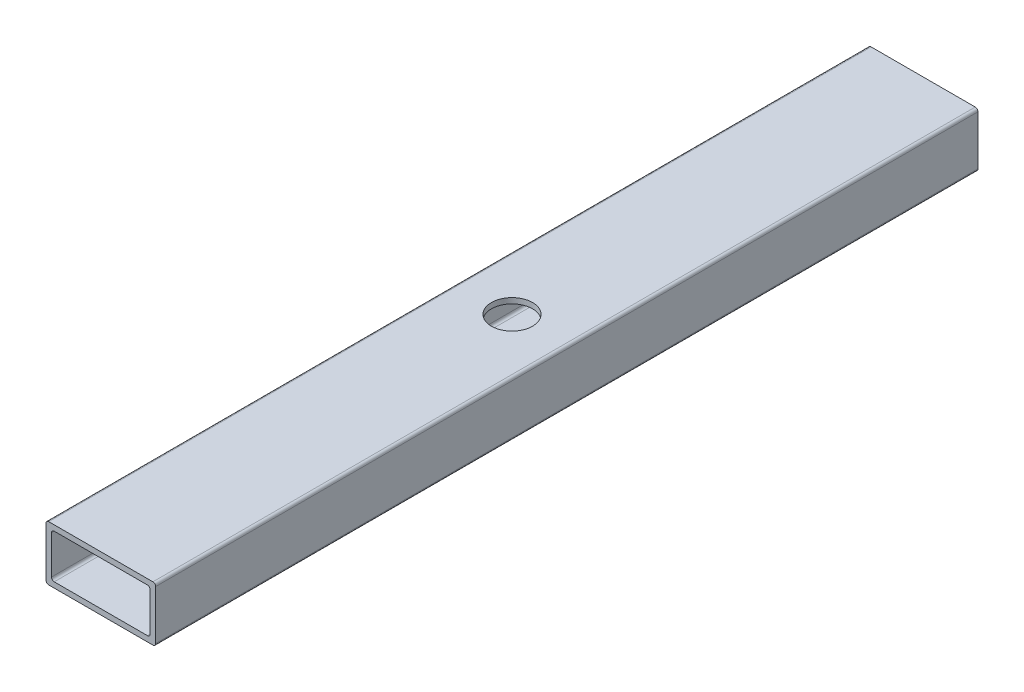
ISO-10303-21;
HEADER;
FILE_DESCRIPTION(('STEP AP214'),'2;1');
FILE_NAME('part.step','',(''),(''),'','','');
FILE_SCHEMA(('AUTOMOTIVE_DESIGN { 1 0 10303 214 1 1 1 1 }'));
ENDSEC;
DATA;
#1=APPLICATION_CONTEXT('core data for automotive mechanical design processes');
#2=APPLICATION_PROTOCOL_DEFINITION('international standard','automotive_design',2000,#1);
#3=PRODUCT_CONTEXT('',#1,'mechanical');
#4=PRODUCT('Part','Part','',(#3));
#5=PRODUCT_RELATED_PRODUCT_CATEGORY('part','',(#4));
#6=PRODUCT_DEFINITION_FORMATION('','',#4);
#7=PRODUCT_DEFINITION_CONTEXT('part definition',#1,'design');
#8=PRODUCT_DEFINITION('design','',#6,#7);
#9=PRODUCT_DEFINITION_SHAPE('','',#8);
#10=(LENGTH_UNIT() NAMED_UNIT(*) SI_UNIT(.MILLI.,.METRE.));
#11=(NAMED_UNIT(*) PLANE_ANGLE_UNIT() SI_UNIT($,.RADIAN.));
#12=(NAMED_UNIT(*) SI_UNIT($,.STERADIAN.) SOLID_ANGLE_UNIT());
#13=UNCERTAINTY_MEASURE_WITH_UNIT(LENGTH_MEASURE(1.E-05),#10,'distance_accuracy_value','');
#14=(GEOMETRIC_REPRESENTATION_CONTEXT(3) GLOBAL_UNCERTAINTY_ASSIGNED_CONTEXT((#13)) GLOBAL_UNIT_ASSIGNED_CONTEXT((#10,
#11,#12)) REPRESENTATION_CONTEXT('',''));
#15=CARTESIAN_POINT('',(0.,0.,0.));
#16=DIRECTION('',(0.,0.,1.));
#17=DIRECTION('',(1.,0.,0.));
#18=AXIS2_PLACEMENT_3D('',#15,#16,#17);
#19=CARTESIAN_POINT('',(78.,0.,600.));
#20=DIRECTION('',(0.,0.,-1.));
#21=DIRECTION('',(-1.,0.,0.));
#22=AXIS2_PLACEMENT_3D('',#19,#20,#21);
#23=PLANE('',#22);
#24=CARTESIAN_POINT('',(78.,0.,600.));
#25=DIRECTION('',(0.,0.,1.));
#26=DIRECTION('',(-1.,0.,0.));
#27=AXIS2_PLACEMENT_3D('',#24,#25,#26);
#28=CIRCLE('',#27,2.);
#29=CARTESIAN_POINT('',(78.,-2.,600.));
#30=VERTEX_POINT('',#29);
#31=CARTESIAN_POINT('',(80.,0.,600.));
#32=VERTEX_POINT('',#31);
#33=EDGE_CURVE('E214',#30,#32,#28,.T.);
#34=ORIENTED_EDGE('',*,*,#33,.T.);
#35=DIRECTION('',(0.,1.,0.));
#36=VECTOR('',#35,1.);
#37=CARTESIAN_POINT('',(80.,0.,600.));
#38=LINE('',#37,#36);
#39=CARTESIAN_POINT('',(80.,36.,600.));
#40=VERTEX_POINT('',#39);
#41=EDGE_CURVE('E217',#32,#40,#38,.T.);
#42=ORIENTED_EDGE('',*,*,#41,.T.);
#43=CARTESIAN_POINT('',(78.,36.,600.));
#44=DIRECTION('',(0.,0.,1.));
#45=DIRECTION('',(1.,0.,0.));
#46=AXIS2_PLACEMENT_3D('',#43,#44,#45);
#47=CIRCLE('',#46,2.);
#48=CARTESIAN_POINT('',(78.,38.,600.));
#49=VERTEX_POINT('',#48);
#50=EDGE_CURVE('E220',#40,#49,#47,.T.);
#51=ORIENTED_EDGE('',*,*,#50,.T.);
#52=DIRECTION('',(-1.,0.,0.));
#53=VECTOR('',#52,1.);
#54=CARTESIAN_POINT('',(2.,38.,600.));
#55=LINE('',#54,#53);
#56=CARTESIAN_POINT('',(2.,38.,600.));
#57=VERTEX_POINT('',#56);
#58=EDGE_CURVE('E222',#49,#57,#55,.T.);
#59=ORIENTED_EDGE('',*,*,#58,.T.);
#60=CARTESIAN_POINT('',(2.,36.,600.));
#61=DIRECTION('',(0.,0.,1.));
#62=DIRECTION('',(-1.,0.,0.));
#63=AXIS2_PLACEMENT_3D('',#60,#61,#62);
#64=CIRCLE('',#63,2.);
#65=CARTESIAN_POINT('',(0.,36.,600.));
#66=VERTEX_POINT('',#65);
#67=EDGE_CURVE('E224',#57,#66,#64,.T.);
#68=ORIENTED_EDGE('',*,*,#67,.T.);
#69=DIRECTION('',(0.,-1.,0.));
#70=VECTOR('',#69,1.);
#71=CARTESIAN_POINT('',(0.,0.,600.));
#72=LINE('',#71,#70);
#73=CARTESIAN_POINT('',(0.,0.,600.));
#74=VERTEX_POINT('',#73);
#75=EDGE_CURVE('E226',#66,#74,#72,.T.);
#76=ORIENTED_EDGE('',*,*,#75,.T.);
#77=CARTESIAN_POINT('',(2.,0.,600.));
#78=DIRECTION('',(0.,0.,1.));
#79=DIRECTION('',(1.,0.,0.));
#80=AXIS2_PLACEMENT_3D('',#77,#78,#79);
#81=CIRCLE('',#80,2.);
#82=CARTESIAN_POINT('',(2.,-2.,600.));
#83=VERTEX_POINT('',#82);
#84=EDGE_CURVE('E228',#74,#83,#81,.T.);
#85=ORIENTED_EDGE('',*,*,#84,.T.);
#86=DIRECTION('',(1.,0.,0.));
#87=VECTOR('',#86,1.);
#88=CARTESIAN_POINT('',(2.,-2.,600.));
#89=LINE('',#88,#87);
#90=EDGE_CURVE('E230',#83,#30,#89,.T.);
#91=ORIENTED_EDGE('',*,*,#90,.T.);
#92=EDGE_LOOP('',(#34,#42,#51,#59,#68,#76,#85,#91));
#93=FACE_BOUND('',#92,.T.);
#94=CARTESIAN_POINT('',(74.,4.,600.));
#95=DIRECTION('',(0.,0.,1.));
#96=DIRECTION('',(1.,0.,0.));
#97=AXIS2_PLACEMENT_3D('',#94,#95,#96);
#98=CIRCLE('',#97,2.);
#99=CARTESIAN_POINT('',(74.,2.,600.));
#100=VERTEX_POINT('',#99);
#101=CARTESIAN_POINT('',(76.,4.,600.));
#102=VERTEX_POINT('',#101);
#103=EDGE_CURVE('E147',#100,#102,#98,.T.);
#104=ORIENTED_EDGE('',*,*,#103,.F.);
#105=DIRECTION('',(1.,0.,0.));
#106=VECTOR('',#105,1.);
#107=CARTESIAN_POINT('',(6.,2.,600.));
#108=LINE('',#107,#106);
#109=CARTESIAN_POINT('',(6.00000000000001,2.,600.));
#110=VERTEX_POINT('',#109);
#111=EDGE_CURVE('E181',#110,#100,#108,.T.);
#112=ORIENTED_EDGE('',*,*,#111,.F.);
#113=CARTESIAN_POINT('',(6.,4.,600.));
#114=DIRECTION('',(0.,0.,1.));
#115=DIRECTION('',(-1.,0.,0.));
#116=AXIS2_PLACEMENT_3D('',#113,#114,#115);
#117=CIRCLE('',#116,2.);
#118=CARTESIAN_POINT('',(4.,4.,600.));
#119=VERTEX_POINT('',#118);
#120=EDGE_CURVE('E179',#119,#110,#117,.T.);
#121=ORIENTED_EDGE('',*,*,#120,.F.);
#122=DIRECTION('',(0.,-1.,0.));
#123=VECTOR('',#122,1.);
#124=CARTESIAN_POINT('',(4.,4.,600.));
#125=LINE('',#124,#123);
#126=CARTESIAN_POINT('',(4.,32.,600.));
#127=VERTEX_POINT('',#126);
#128=EDGE_CURVE('E177',#127,#119,#125,.T.);
#129=ORIENTED_EDGE('',*,*,#128,.F.);
#130=CARTESIAN_POINT('',(6.,32.,600.));
#131=DIRECTION('',(0.,0.,1.));
#132=DIRECTION('',(1.,0.,0.));
#133=AXIS2_PLACEMENT_3D('',#130,#131,#132);
#134=CIRCLE('',#133,2.);
#135=CARTESIAN_POINT('',(6.,34.,600.));
#136=VERTEX_POINT('',#135);
#137=EDGE_CURVE('E175',#136,#127,#134,.T.);
#138=ORIENTED_EDGE('',*,*,#137,.F.);
#139=DIRECTION('',(-1.,0.,0.));
#140=VECTOR('',#139,1.);
#141=CARTESIAN_POINT('',(6.,34.,600.));
#142=LINE('',#141,#140);
#143=CARTESIAN_POINT('',(74.,34.,600.));
#144=VERTEX_POINT('',#143);
#145=EDGE_CURVE('E170',#144,#136,#142,.T.);
#146=ORIENTED_EDGE('',*,*,#145,.F.);
#147=CARTESIAN_POINT('',(74.,32.,600.));
#148=DIRECTION('',(0.,0.,1.));
#149=DIRECTION('',(-1.,0.,0.));
#150=AXIS2_PLACEMENT_3D('',#147,#148,#149);
#151=CIRCLE('',#150,2.);
#152=CARTESIAN_POINT('',(76.,32.,600.));
#153=VERTEX_POINT('',#152);
#154=EDGE_CURVE('E168',#153,#144,#151,.T.);
#155=ORIENTED_EDGE('',*,*,#154,.F.);
#156=DIRECTION('',(0.,1.,0.));
#157=VECTOR('',#156,1.);
#158=CARTESIAN_POINT('',(76.,4.,600.));
#159=LINE('',#158,#157);
#160=EDGE_CURVE('E155',#102,#153,#159,.T.);
#161=ORIENTED_EDGE('',*,*,#160,.F.);
#162=EDGE_LOOP('',(#104,#112,#121,#129,#138,#146,#155,#161));
#163=FACE_BOUND('',#162,.T.);
#164=ADVANCED_FACE('F33',(#93,#163),#23,.F.);
#165=CARTESIAN_POINT('',(78.,0.,0.));
#166=DIRECTION('',(0.,0.,-1.));
#167=DIRECTION('',(-1.,0.,0.));
#168=AXIS2_PLACEMENT_3D('',#165,#166,#167);
#169=PLANE('',#168);
#170=CARTESIAN_POINT('',(78.,0.,0.));
#171=DIRECTION('',(0.,0.,1.));
#172=DIRECTION('',(-1.,0.,0.));
#173=AXIS2_PLACEMENT_3D('',#170,#171,#172);
#174=CIRCLE('',#173,2.);
#175=CARTESIAN_POINT('',(78.,-2.,0.));
#176=VERTEX_POINT('',#175);
#177=CARTESIAN_POINT('',(80.,0.,0.));
#178=VERTEX_POINT('',#177);
#179=EDGE_CURVE('E163',#176,#178,#174,.T.);
#180=ORIENTED_EDGE('',*,*,#179,.F.);
#181=DIRECTION('',(1.,0.,0.));
#182=VECTOR('',#181,1.);
#183=CARTESIAN_POINT('',(2.,-2.,0.));
#184=LINE('',#183,#182);
#185=CARTESIAN_POINT('',(2.,-2.,0.));
#186=VERTEX_POINT('',#185);
#187=EDGE_CURVE('E218',#186,#176,#184,.T.);
#188=ORIENTED_EDGE('',*,*,#187,.F.);
#189=CARTESIAN_POINT('',(2.,0.,0.));
#190=DIRECTION('',(0.,0.,1.));
#191=DIRECTION('',(1.,0.,0.));
#192=AXIS2_PLACEMENT_3D('',#189,#190,#191);
#193=CIRCLE('',#192,2.);
#194=CARTESIAN_POINT('',(0.,0.,0.));
#195=VERTEX_POINT('',#194);
#196=EDGE_CURVE('E245',#195,#186,#193,.T.);
#197=ORIENTED_EDGE('',*,*,#196,.F.);
#198=DIRECTION('',(0.,-1.,0.));
#199=VECTOR('',#198,1.);
#200=CARTESIAN_POINT('',(0.,0.,0.));
#201=LINE('',#200,#199);
#202=CARTESIAN_POINT('',(0.,36.,0.));
#203=VERTEX_POINT('',#202);
#204=EDGE_CURVE('E243',#203,#195,#201,.T.);
#205=ORIENTED_EDGE('',*,*,#204,.F.);
#206=CARTESIAN_POINT('',(2.,36.,0.));
#207=DIRECTION('',(0.,0.,1.));
#208=DIRECTION('',(-1.,0.,0.));
#209=AXIS2_PLACEMENT_3D('',#206,#207,#208);
#210=CIRCLE('',#209,2.);
#211=CARTESIAN_POINT('',(2.,38.,0.));
#212=VERTEX_POINT('',#211);
#213=EDGE_CURVE('E241',#212,#203,#210,.T.);
#214=ORIENTED_EDGE('',*,*,#213,.F.);
#215=DIRECTION('',(-1.,0.,0.));
#216=VECTOR('',#215,1.);
#217=CARTESIAN_POINT('',(2.,38.,0.));
#218=LINE('',#217,#216);
#219=CARTESIAN_POINT('',(78.,38.,0.));
#220=VERTEX_POINT('',#219);
#221=EDGE_CURVE('E239',#220,#212,#218,.T.);
#222=ORIENTED_EDGE('',*,*,#221,.F.);
#223=CARTESIAN_POINT('',(78.,36.,0.));
#224=DIRECTION('',(0.,0.,1.));
#225=DIRECTION('',(1.,0.,0.));
#226=AXIS2_PLACEMENT_3D('',#223,#224,#225);
#227=CIRCLE('',#226,2.);
#228=CARTESIAN_POINT('',(80.,36.,0.));
#229=VERTEX_POINT('',#228);
#230=EDGE_CURVE('E237',#229,#220,#227,.T.);
#231=ORIENTED_EDGE('',*,*,#230,.F.);
#232=DIRECTION('',(0.,1.,0.));
#233=VECTOR('',#232,1.);
#234=CARTESIAN_POINT('',(80.,0.,0.));
#235=LINE('',#234,#233);
#236=EDGE_CURVE('E235',#178,#229,#235,.T.);
#237=ORIENTED_EDGE('',*,*,#236,.F.);
#238=EDGE_LOOP('',(#180,#188,#197,#205,#214,#222,#231,#237));
#239=FACE_BOUND('',#238,.T.);
#240=DIRECTION('',(1.,0.,0.));
#241=VECTOR('',#240,1.);
#242=CARTESIAN_POINT('',(6.,2.,0.));
#243=LINE('',#242,#241);
#244=CARTESIAN_POINT('',(6.,2.,0.));
#245=VERTEX_POINT('',#244);
#246=CARTESIAN_POINT('',(74.,2.,0.));
#247=VERTEX_POINT('',#246);
#248=EDGE_CURVE('E156',#245,#247,#243,.T.);
#249=ORIENTED_EDGE('',*,*,#248,.T.);
#250=CARTESIAN_POINT('',(74.,4.,0.));
#251=DIRECTION('',(0.,0.,1.));
#252=DIRECTION('',(1.,0.,0.));
#253=AXIS2_PLACEMENT_3D('',#250,#251,#252);
#254=CIRCLE('',#253,2.);
#255=CARTESIAN_POINT('',(76.,4.,0.));
#256=VERTEX_POINT('',#255);
#257=EDGE_CURVE('E57',#247,#256,#254,.T.);
#258=ORIENTED_EDGE('',*,*,#257,.T.);
#259=DIRECTION('',(0.,1.,0.));
#260=VECTOR('',#259,1.);
#261=CARTESIAN_POINT('',(76.,4.,0.));
#262=LINE('',#261,#260);
#263=CARTESIAN_POINT('',(76.,32.,0.));
#264=VERTEX_POINT('',#263);
#265=EDGE_CURVE('E162',#256,#264,#262,.T.);
#266=ORIENTED_EDGE('',*,*,#265,.T.);
#267=CARTESIAN_POINT('',(74.,32.,0.));
#268=DIRECTION('',(0.,0.,1.));
#269=DIRECTION('',(-1.,0.,0.));
#270=AXIS2_PLACEMENT_3D('',#267,#268,#269);
#271=CIRCLE('',#270,2.);
#272=CARTESIAN_POINT('',(74.,34.,0.));
#273=VERTEX_POINT('',#272);
#274=EDGE_CURVE('E186',#264,#273,#271,.T.);
#275=ORIENTED_EDGE('',*,*,#274,.T.);
#276=DIRECTION('',(-1.,0.,0.));
#277=VECTOR('',#276,1.);
#278=CARTESIAN_POINT('',(6.,34.,0.));
#279=LINE('',#278,#277);
#280=CARTESIAN_POINT('',(6.,34.,0.));
#281=VERTEX_POINT('',#280);
#282=EDGE_CURVE('E189',#273,#281,#279,.T.);
#283=ORIENTED_EDGE('',*,*,#282,.T.);
#284=CARTESIAN_POINT('',(6.,32.,0.));
#285=DIRECTION('',(0.,0.,1.));
#286=DIRECTION('',(1.,0.,0.));
#287=AXIS2_PLACEMENT_3D('',#284,#285,#286);
#288=CIRCLE('',#287,2.);
#289=CARTESIAN_POINT('',(4.,32.,0.));
#290=VERTEX_POINT('',#289);
#291=EDGE_CURVE('E192',#281,#290,#288,.T.);
#292=ORIENTED_EDGE('',*,*,#291,.T.);
#293=DIRECTION('',(0.,-1.,0.));
#294=VECTOR('',#293,1.);
#295=CARTESIAN_POINT('',(4.,4.,0.));
#296=LINE('',#295,#294);
#297=CARTESIAN_POINT('',(4.,4.,0.));
#298=VERTEX_POINT('',#297);
#299=EDGE_CURVE('E195',#290,#298,#296,.T.);
#300=ORIENTED_EDGE('',*,*,#299,.T.);
#301=CARTESIAN_POINT('',(6.,4.,0.));
#302=DIRECTION('',(0.,0.,1.));
#303=DIRECTION('',(-1.,0.,0.));
#304=AXIS2_PLACEMENT_3D('',#301,#302,#303);
#305=CIRCLE('',#304,2.);
#306=EDGE_CURVE('E198',#298,#245,#305,.T.);
#307=ORIENTED_EDGE('',*,*,#306,.T.);
#308=EDGE_LOOP('',(#249,#258,#266,#275,#283,#292,#300,#307));
#309=FACE_BOUND('',#308,.T.);
#310=ADVANCED_FACE('F276',(#239,#309),#169,.T.);
#311=CARTESIAN_POINT('',(78.,0.,600.));
#312=DIRECTION('',(0.,0.,-1.));
#313=DIRECTION('',(-1.,0.,0.));
#314=AXIS2_PLACEMENT_3D('',#311,#312,#313);
#315=CYLINDRICAL_SURFACE('',#314,2.);
#316=ORIENTED_EDGE('',*,*,#179,.T.);
#317=DIRECTION('',(0.,0.,-1.));
#318=VECTOR('',#317,1.);
#319=CARTESIAN_POINT('',(80.,0.,600.));
#320=LINE('',#319,#318);
#321=EDGE_CURVE('E11',#32,#178,#320,.T.);
#322=ORIENTED_EDGE('',*,*,#321,.F.);
#323=ORIENTED_EDGE('',*,*,#33,.F.);
#324=DIRECTION('',(0.,0.,-1.));
#325=VECTOR('',#324,1.);
#326=CARTESIAN_POINT('',(78.,-2.,600.));
#327=LINE('',#326,#325);
#328=EDGE_CURVE('E232',#30,#176,#327,.T.);
#329=ORIENTED_EDGE('',*,*,#328,.T.);
#330=EDGE_LOOP('',(#316,#322,#323,#329));
#331=FACE_BOUND('',#330,.T.);
#332=ADVANCED_FACE('F35',(#331),#315,.T.);
#333=CARTESIAN_POINT('',(80.,0.,600.));
#334=DIRECTION('',(-1.,0.,0.));
#335=DIRECTION('',(0.,0.,1.));
#336=AXIS2_PLACEMENT_3D('',#333,#334,#335);
#337=PLANE('',#336);
#338=ORIENTED_EDGE('',*,*,#236,.T.);
#339=DIRECTION('',(0.,0.,-1.));
#340=VECTOR('',#339,1.);
#341=CARTESIAN_POINT('',(80.,36.,600.));
#342=LINE('',#341,#340);
#343=EDGE_CURVE('E42',#40,#229,#342,.T.);
#344=ORIENTED_EDGE('',*,*,#343,.F.);
#345=ORIENTED_EDGE('',*,*,#41,.F.);
#346=ORIENTED_EDGE('',*,*,#321,.T.);
#347=EDGE_LOOP('',(#338,#344,#345,#346));
#348=FACE_BOUND('',#347,.T.);
#349=ADVANCED_FACE('F293',(#348),#337,.F.);
#350=CARTESIAN_POINT('',(78.,36.,600.));
#351=DIRECTION('',(0.,0.,-1.));
#352=DIRECTION('',(-1.,0.,0.));
#353=AXIS2_PLACEMENT_3D('',#350,#351,#352);
#354=CYLINDRICAL_SURFACE('',#353,2.);
#355=ORIENTED_EDGE('',*,*,#230,.T.);
#356=DIRECTION('',(0.,0.,-1.));
#357=VECTOR('',#356,1.);
#358=CARTESIAN_POINT('',(78.,38.,600.));
#359=LINE('',#358,#357);
#360=EDGE_CURVE('E262',#49,#220,#359,.T.);
#361=ORIENTED_EDGE('',*,*,#360,.F.);
#362=ORIENTED_EDGE('',*,*,#50,.F.);
#363=ORIENTED_EDGE('',*,*,#343,.T.);
#364=EDGE_LOOP('',(#355,#361,#362,#363));
#365=FACE_BOUND('',#364,.T.);
#366=ADVANCED_FACE('F270',(#365),#354,.T.);
#367=CARTESIAN_POINT('',(2.,38.,600.));
#368=DIRECTION('',(0.,-1.,0.));
#369=DIRECTION('',(1.,0.,0.));
#370=AXIS2_PLACEMENT_3D('',#367,#368,#369);
#371=PLANE('',#370);
#372=CARTESIAN_POINT('',(40.,38.,300.));
#373=DIRECTION('',(0.,1.,0.));
#374=DIRECTION('',(-1.,0.,0.));
#375=AXIS2_PLACEMENT_3D('',#372,#373,#374);
#376=CIRCLE('',#375,15.);
#377=CARTESIAN_POINT('',(25.,38.,300.));
#378=VERTEX_POINT('',#377);
#379=EDGE_CURVE('E333',#378,#378,#376,.T.);
#380=ORIENTED_EDGE('',*,*,#379,.F.);
#381=EDGE_LOOP('',(#380));
#382=FACE_BOUND('',#381,.T.);
#383=ORIENTED_EDGE('',*,*,#221,.T.);
#384=DIRECTION('',(0.,0.,-1.));
#385=VECTOR('',#384,1.);
#386=CARTESIAN_POINT('',(2.,38.,600.));
#387=LINE('',#386,#385);
#388=EDGE_CURVE('E259',#57,#212,#387,.T.);
#389=ORIENTED_EDGE('',*,*,#388,.F.);
#390=ORIENTED_EDGE('',*,*,#58,.F.);
#391=ORIENTED_EDGE('',*,*,#360,.T.);
#392=EDGE_LOOP('',(#383,#389,#390,#391));
#393=FACE_BOUND('',#392,.T.);
#394=ADVANCED_FACE('F282',(#382,#393),#371,.F.);
#395=CARTESIAN_POINT('',(2.,36.,600.));
#396=DIRECTION('',(0.,0.,-1.));
#397=DIRECTION('',(-1.,0.,0.));
#398=AXIS2_PLACEMENT_3D('',#395,#396,#397);
#399=CYLINDRICAL_SURFACE('',#398,2.);
#400=ORIENTED_EDGE('',*,*,#213,.T.);
#401=DIRECTION('',(0.,0.,-1.));
#402=VECTOR('',#401,1.);
#403=CARTESIAN_POINT('',(0.,36.,600.));
#404=LINE('',#403,#402);
#405=EDGE_CURVE('E256',#66,#203,#404,.T.);
#406=ORIENTED_EDGE('',*,*,#405,.F.);
#407=ORIENTED_EDGE('',*,*,#67,.F.);
#408=ORIENTED_EDGE('',*,*,#388,.T.);
#409=EDGE_LOOP('',(#400,#406,#407,#408));
#410=FACE_BOUND('',#409,.T.);
#411=ADVANCED_FACE('F286',(#410),#399,.T.);
#412=CARTESIAN_POINT('',(0.,0.,600.));
#413=DIRECTION('',(1.,0.,0.));
#414=DIRECTION('',(0.,0.,-1.));
#415=AXIS2_PLACEMENT_3D('',#412,#413,#414);
#416=PLANE('',#415);
#417=ORIENTED_EDGE('',*,*,#204,.T.);
#418=DIRECTION('',(0.,0.,-1.));
#419=VECTOR('',#418,1.);
#420=CARTESIAN_POINT('',(0.,0.,600.));
#421=LINE('',#420,#419);
#422=EDGE_CURVE('E253',#74,#195,#421,.T.);
#423=ORIENTED_EDGE('',*,*,#422,.F.);
#424=ORIENTED_EDGE('',*,*,#75,.F.);
#425=ORIENTED_EDGE('',*,*,#405,.T.);
#426=EDGE_LOOP('',(#417,#423,#424,#425));
#427=FACE_BOUND('',#426,.T.);
#428=ADVANCED_FACE('F306',(#427),#416,.F.);
#429=CARTESIAN_POINT('',(2.,0.,600.));
#430=DIRECTION('',(0.,0.,-1.));
#431=DIRECTION('',(-1.,0.,0.));
#432=AXIS2_PLACEMENT_3D('',#429,#430,#431);
#433=CYLINDRICAL_SURFACE('',#432,2.);
#434=ORIENTED_EDGE('',*,*,#196,.T.);
#435=DIRECTION('',(0.,0.,-1.));
#436=VECTOR('',#435,1.);
#437=CARTESIAN_POINT('',(2.,-2.,600.));
#438=LINE('',#437,#436);
#439=EDGE_CURVE('E250',#83,#186,#438,.T.);
#440=ORIENTED_EDGE('',*,*,#439,.F.);
#441=ORIENTED_EDGE('',*,*,#84,.F.);
#442=ORIENTED_EDGE('',*,*,#422,.T.);
#443=EDGE_LOOP('',(#434,#440,#441,#442));
#444=FACE_BOUND('',#443,.T.);
#445=ADVANCED_FACE('F304',(#444),#433,.T.);
#446=CARTESIAN_POINT('',(2.,-2.,600.));
#447=DIRECTION('',(0.,1.,0.));
#448=DIRECTION('',(0.,0.,1.));
#449=AXIS2_PLACEMENT_3D('',#446,#447,#448);
#450=PLANE('',#449);
#451=CARTESIAN_POINT('',(40.,-2.,300.));
#452=DIRECTION('',(0.,1.,0.));
#453=DIRECTION('',(-1.,0.,0.));
#454=AXIS2_PLACEMENT_3D('',#451,#452,#453);
#455=CIRCLE('',#454,15.);
#456=CARTESIAN_POINT('',(25.,-2.,300.));
#457=VERTEX_POINT('',#456);
#458=EDGE_CURVE('E331',#457,#457,#455,.T.);
#459=ORIENTED_EDGE('',*,*,#458,.T.);
#460=EDGE_LOOP('',(#459));
#461=FACE_BOUND('',#460,.T.);
#462=ORIENTED_EDGE('',*,*,#187,.T.);
#463=ORIENTED_EDGE('',*,*,#328,.F.);
#464=ORIENTED_EDGE('',*,*,#90,.F.);
#465=ORIENTED_EDGE('',*,*,#439,.T.);
#466=EDGE_LOOP('',(#462,#463,#464,#465));
#467=FACE_BOUND('',#466,.T.);
#468=ADVANCED_FACE('F299',(#461,#467),#450,.F.);
#469=CARTESIAN_POINT('',(74.,4.,600.));
#470=DIRECTION('',(0.,0.,-1.));
#471=DIRECTION('',(-1.,0.,0.));
#472=AXIS2_PLACEMENT_3D('',#469,#470,#471);
#473=CYLINDRICAL_SURFACE('',#472,2.);
#474=ORIENTED_EDGE('',*,*,#257,.F.);
#475=DIRECTION('',(0.,0.,-1.));
#476=VECTOR('',#475,1.);
#477=CARTESIAN_POINT('',(74.,2.,600.));
#478=LINE('',#477,#476);
#479=EDGE_CURVE('E151',#100,#247,#478,.T.);
#480=ORIENTED_EDGE('',*,*,#479,.F.);
#481=ORIENTED_EDGE('',*,*,#103,.T.);
#482=DIRECTION('',(0.,0.,-1.));
#483=VECTOR('',#482,1.);
#484=CARTESIAN_POINT('',(76.,4.,600.));
#485=LINE('',#484,#483);
#486=EDGE_CURVE('E150',#102,#256,#485,.T.);
#487=ORIENTED_EDGE('',*,*,#486,.T.);
#488=EDGE_LOOP('',(#474,#480,#481,#487));
#489=FACE_BOUND('',#488,.T.);
#490=ADVANCED_FACE('F149',(#489),#473,.F.);
#491=CARTESIAN_POINT('',(76.,4.,600.));
#492=DIRECTION('',(-1.,0.,0.));
#493=DIRECTION('',(0.,0.,1.));
#494=AXIS2_PLACEMENT_3D('',#491,#492,#493);
#495=PLANE('',#494);
#496=ORIENTED_EDGE('',*,*,#265,.F.);
#497=ORIENTED_EDGE('',*,*,#486,.F.);
#498=ORIENTED_EDGE('',*,*,#160,.T.);
#499=DIRECTION('',(0.,0.,-1.));
#500=VECTOR('',#499,1.);
#501=CARTESIAN_POINT('',(76.,32.,600.));
#502=LINE('',#501,#500);
#503=EDGE_CURVE('E164',#153,#264,#502,.T.);
#504=ORIENTED_EDGE('',*,*,#503,.T.);
#505=EDGE_LOOP('',(#496,#497,#498,#504));
#506=FACE_BOUND('',#505,.T.);
#507=ADVANCED_FACE('F159',(#506),#495,.T.);
#508=CARTESIAN_POINT('',(74.,32.,600.));
#509=DIRECTION('',(0.,0.,-1.));
#510=DIRECTION('',(-1.,0.,0.));
#511=AXIS2_PLACEMENT_3D('',#508,#509,#510);
#512=CYLINDRICAL_SURFACE('',#511,2.);
#513=ORIENTED_EDGE('',*,*,#274,.F.);
#514=ORIENTED_EDGE('',*,*,#503,.F.);
#515=ORIENTED_EDGE('',*,*,#154,.T.);
#516=DIRECTION('',(0.,0.,-1.));
#517=VECTOR('',#516,1.);
#518=CARTESIAN_POINT('',(74.,34.,600.));
#519=LINE('',#518,#517);
#520=EDGE_CURVE('E211',#144,#273,#519,.T.);
#521=ORIENTED_EDGE('',*,*,#520,.T.);
#522=EDGE_LOOP('',(#513,#514,#515,#521));
#523=FACE_BOUND('',#522,.T.);
#524=ADVANCED_FACE('F348',(#523),#512,.F.);
#525=CARTESIAN_POINT('',(6.,34.,600.));
#526=DIRECTION('',(0.,-1.,0.));
#527=DIRECTION('',(0.,0.,-1.));
#528=AXIS2_PLACEMENT_3D('',#525,#526,#527);
#529=PLANE('',#528);
#530=CARTESIAN_POINT('',(40.,34.,300.));
#531=DIRECTION('',(0.,-1.,0.));
#532=DIRECTION('',(0.,0.,-1.));
#533=AXIS2_PLACEMENT_3D('',#530,#531,#532);
#534=CIRCLE('',#533,15.);
#535=CARTESIAN_POINT('',(40.,34.,285.));
#536=VERTEX_POINT('',#535);
#537=EDGE_CURVE('E184',#536,#536,#534,.T.);
#538=ORIENTED_EDGE('',*,*,#537,.F.);
#539=EDGE_LOOP('',(#538));
#540=FACE_BOUND('',#539,.T.);
#541=ORIENTED_EDGE('',*,*,#282,.F.);
#542=ORIENTED_EDGE('',*,*,#520,.F.);
#543=ORIENTED_EDGE('',*,*,#145,.T.);
#544=DIRECTION('',(0.,0.,-1.));
#545=VECTOR('',#544,1.);
#546=CARTESIAN_POINT('',(6.,34.,600.));
#547=LINE('',#546,#545);
#548=EDGE_CURVE('E209',#136,#281,#547,.T.);
#549=ORIENTED_EDGE('',*,*,#548,.T.);
#550=EDGE_LOOP('',(#541,#542,#543,#549));
#551=FACE_BOUND('',#550,.T.);
#552=ADVANCED_FACE('F344',(#540,#551),#529,.T.);
#553=CARTESIAN_POINT('',(6.,32.,600.));
#554=DIRECTION('',(0.,0.,-1.));
#555=DIRECTION('',(-1.,0.,0.));
#556=AXIS2_PLACEMENT_3D('',#553,#554,#555);
#557=CYLINDRICAL_SURFACE('',#556,2.);
#558=ORIENTED_EDGE('',*,*,#291,.F.);
#559=ORIENTED_EDGE('',*,*,#548,.F.);
#560=ORIENTED_EDGE('',*,*,#137,.T.);
#561=DIRECTION('',(0.,0.,-1.));
#562=VECTOR('',#561,1.);
#563=CARTESIAN_POINT('',(4.,32.,600.));
#564=LINE('',#563,#562);
#565=EDGE_CURVE('E207',#127,#290,#564,.T.);
#566=ORIENTED_EDGE('',*,*,#565,.T.);
#567=EDGE_LOOP('',(#558,#559,#560,#566));
#568=FACE_BOUND('',#567,.T.);
#569=ADVANCED_FACE('F347',(#568),#557,.F.);
#570=CARTESIAN_POINT('',(4.,4.,600.));
#571=DIRECTION('',(1.,0.,0.));
#572=DIRECTION('',(0.,0.,-1.));
#573=AXIS2_PLACEMENT_3D('',#570,#571,#572);
#574=PLANE('',#573);
#575=ORIENTED_EDGE('',*,*,#299,.F.);
#576=ORIENTED_EDGE('',*,*,#565,.F.);
#577=ORIENTED_EDGE('',*,*,#128,.T.);
#578=DIRECTION('',(0.,0.,-1.));
#579=VECTOR('',#578,1.);
#580=CARTESIAN_POINT('',(4.,4.,600.));
#581=LINE('',#580,#579);
#582=EDGE_CURVE('E205',#119,#298,#581,.T.);
#583=ORIENTED_EDGE('',*,*,#582,.T.);
#584=EDGE_LOOP('',(#575,#576,#577,#583));
#585=FACE_BOUND('',#584,.T.);
#586=ADVANCED_FACE('F364',(#585),#574,.T.);
#587=CARTESIAN_POINT('',(6.,4.,600.));
#588=DIRECTION('',(0.,0.,-1.));
#589=DIRECTION('',(-1.,0.,0.));
#590=AXIS2_PLACEMENT_3D('',#587,#588,#589);
#591=CYLINDRICAL_SURFACE('',#590,2.);
#592=ORIENTED_EDGE('',*,*,#306,.F.);
#593=ORIENTED_EDGE('',*,*,#582,.F.);
#594=ORIENTED_EDGE('',*,*,#120,.T.);
#595=DIRECTION('',(0.,0.,-1.));
#596=VECTOR('',#595,1.);
#597=CARTESIAN_POINT('',(6.,2.,600.));
#598=LINE('',#597,#596);
#599=EDGE_CURVE('E49',#110,#245,#598,.T.);
#600=ORIENTED_EDGE('',*,*,#599,.T.);
#601=EDGE_LOOP('',(#592,#593,#594,#600));
#602=FACE_BOUND('',#601,.T.);
#603=ADVANCED_FACE('F368',(#602),#591,.F.);
#604=CARTESIAN_POINT('',(6.,2.,600.));
#605=DIRECTION('',(0.,1.,0.));
#606=DIRECTION('',(0.,0.,1.));
#607=AXIS2_PLACEMENT_3D('',#604,#605,#606);
#608=PLANE('',#607);
#609=CARTESIAN_POINT('',(40.,2.,300.));
#610=DIRECTION('',(0.,1.,0.));
#611=DIRECTION('',(0.,0.,1.));
#612=AXIS2_PLACEMENT_3D('',#609,#610,#611);
#613=CIRCLE('',#612,15.);
#614=CARTESIAN_POINT('',(40.,2.,315.));
#615=VERTEX_POINT('',#614);
#616=EDGE_CURVE('E37',#615,#615,#613,.T.);
#617=ORIENTED_EDGE('',*,*,#616,.F.);
#618=EDGE_LOOP('',(#617));
#619=FACE_BOUND('',#618,.T.);
#620=ORIENTED_EDGE('',*,*,#248,.F.);
#621=ORIENTED_EDGE('',*,*,#599,.F.);
#622=ORIENTED_EDGE('',*,*,#111,.T.);
#623=ORIENTED_EDGE('',*,*,#479,.T.);
#624=EDGE_LOOP('',(#620,#621,#622,#623));
#625=FACE_BOUND('',#624,.T.);
#626=ADVANCED_FACE('F372',(#619,#625),#608,.T.);
#627=CARTESIAN_POINT('',(40.,-2.,300.));
#628=DIRECTION('',(0.,1.,0.));
#629=DIRECTION('',(-1.,0.,0.));
#630=AXIS2_PLACEMENT_3D('',#627,#628,#629);
#631=CYLINDRICAL_SURFACE('',#630,15.);
#632=ORIENTED_EDGE('',*,*,#616,.T.);
#633=EDGE_LOOP('',(#632));
#634=FACE_BOUND('',#633,.T.);
#635=ORIENTED_EDGE('',*,*,#458,.F.);
#636=EDGE_LOOP('',(#635));
#637=FACE_BOUND('',#636,.T.);
#638=ADVANCED_FACE('F376',(#634,#637),#631,.F.);
#639=ORIENTED_EDGE('',*,*,#537,.T.);
#640=EDGE_LOOP('',(#639));
#641=FACE_BOUND('',#640,.T.);
#642=ORIENTED_EDGE('',*,*,#379,.T.);
#643=EDGE_LOOP('',(#642));
#644=FACE_BOUND('',#643,.T.);
#645=ADVANCED_FACE('F341',(#641,#644),#631,.F.);
#646=CLOSED_SHELL('',(#164,#310,#332,#349,#366,#394,#411,#428,#445,#468,#490,#507,#524,#552,
#569,#586,#603,#626,#638,#645));
#647=MANIFOLD_SOLID_BREP('B2',#646);
#648=ADVANCED_BREP_SHAPE_REPRESENTATION('',(#18,#647),#14);
#649=SHAPE_DEFINITION_REPRESENTATION(#9,#648);
ENDSEC;
END-ISO-10303-21;
